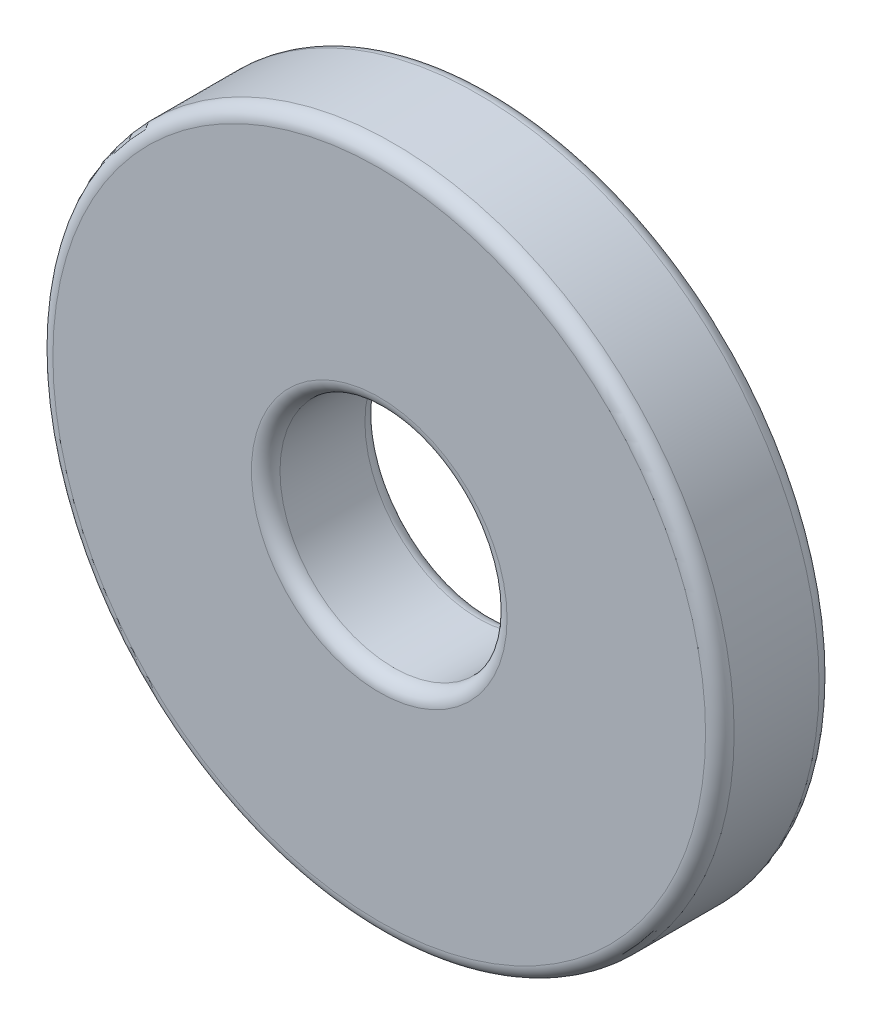
ISO-10303-21;
HEADER;
FILE_DESCRIPTION(('STEP AP214'),'2;1');
FILE_NAME('part.step','',(''),(''),'','','');
FILE_SCHEMA(('AUTOMOTIVE_DESIGN { 1 0 10303 214 1 1 1 1 }'));
ENDSEC;
DATA;
#1=APPLICATION_CONTEXT('core data for automotive mechanical design processes');
#2=APPLICATION_PROTOCOL_DEFINITION('international standard','automotive_design',2000,#1);
#3=PRODUCT_CONTEXT('',#1,'mechanical');
#4=PRODUCT('Part','Part','',(#3));
#5=PRODUCT_RELATED_PRODUCT_CATEGORY('part','',(#4));
#6=PRODUCT_DEFINITION_FORMATION('','',#4);
#7=PRODUCT_DEFINITION_CONTEXT('part definition',#1,'design');
#8=PRODUCT_DEFINITION('design','',#6,#7);
#9=PRODUCT_DEFINITION_SHAPE('','',#8);
#10=(LENGTH_UNIT() NAMED_UNIT(*) SI_UNIT(.MILLI.,.METRE.));
#11=(NAMED_UNIT(*) PLANE_ANGLE_UNIT() SI_UNIT($,.RADIAN.));
#12=(NAMED_UNIT(*) SI_UNIT($,.STERADIAN.) SOLID_ANGLE_UNIT());
#13=UNCERTAINTY_MEASURE_WITH_UNIT(LENGTH_MEASURE(1.E-05),#10,'distance_accuracy_value','');
#14=(GEOMETRIC_REPRESENTATION_CONTEXT(3) GLOBAL_UNCERTAINTY_ASSIGNED_CONTEXT((#13)) GLOBAL_UNIT_ASSIGNED_CONTEXT((#10,
#11,#12)) REPRESENTATION_CONTEXT('',''));
#15=CARTESIAN_POINT('',(0.,0.,0.));
#16=DIRECTION('',(0.,0.,1.));
#17=DIRECTION('',(1.,0.,0.));
#18=AXIS2_PLACEMENT_3D('',#15,#16,#17);
#19=CARTESIAN_POINT('',(68.3982464909084,3.21438697688714,1.5875));
#20=DIRECTION('',(0.,0.,-1.));
#21=DIRECTION('',(-1.,0.,0.));
#22=AXIS2_PLACEMENT_3D('',#19,#20,#21);
#23=CYLINDRICAL_SURFACE('',#22,4.7625);
#24=CARTESIAN_POINT('',(68.3982464909084,3.21438697688714,0.2));
#25=DIRECTION('',(0.,0.,1.));
#26=DIRECTION('',(1.,0.,0.));
#27=AXIS2_PLACEMENT_3D('',#24,#25,#26);
#28=CIRCLE('',#27,4.7625);
#29=CARTESIAN_POINT('',(73.1607464909084,3.21438697688714,0.2));
#30=VERTEX_POINT('',#29);
#31=EDGE_CURVE('E45',#30,#30,#28,.T.);
#32=ORIENTED_EDGE('',*,*,#31,.T.);
#33=EDGE_LOOP('',(#32));
#34=FACE_BOUND('',#33,.T.);
#35=CARTESIAN_POINT('',(68.3982464909084,3.21438697688714,1.3875));
#36=DIRECTION('',(0.,0.,1.));
#37=DIRECTION('',(1.,0.,0.));
#38=AXIS2_PLACEMENT_3D('',#35,#36,#37);
#39=CIRCLE('',#38,4.7625);
#40=CARTESIAN_POINT('',(73.1607464909084,3.21438697688714,1.3875));
#41=VERTEX_POINT('',#40);
#42=EDGE_CURVE('E50',#41,#41,#39,.F.);
#43=ORIENTED_EDGE('',*,*,#42,.T.);
#44=EDGE_LOOP('',(#43));
#45=FACE_BOUND('',#44,.T.);
#46=ADVANCED_FACE('F37',(#34,#45),#23,.T.);
#47=CARTESIAN_POINT('',(68.3982464909084,3.21438697688714,1.5875));
#48=DIRECTION('',(0.,0.,1.));
#49=DIRECTION('',(1.,0.,0.));
#50=AXIS2_PLACEMENT_3D('',#47,#48,#49);
#51=PLANE('',#50);
#52=CARTESIAN_POINT('',(68.3982464909084,3.21438697688714,1.5875));
#53=DIRECTION('',(0.,0.,1.));
#54=DIRECTION('',(1.,0.,0.));
#55=AXIS2_PLACEMENT_3D('',#52,#53,#54);
#56=CIRCLE('',#55,4.5625);
#57=CARTESIAN_POINT('',(72.9607464909084,3.21438697688714,1.5875));
#58=VERTEX_POINT('',#57);
#59=EDGE_CURVE('E55',#58,#58,#56,.T.);
#60=ORIENTED_EDGE('',*,*,#59,.T.);
#61=EDGE_LOOP('',(#60));
#62=FACE_BOUND('',#61,.T.);
#63=CARTESIAN_POINT('',(68.3982464909084,3.21438697688714,1.5875));
#64=DIRECTION('',(0.,0.,1.));
#65=DIRECTION('',(1.,0.,0.));
#66=AXIS2_PLACEMENT_3D('',#63,#64,#65);
#67=CIRCLE('',#66,1.7875);
#68=CARTESIAN_POINT('',(70.1857464909084,3.21438697688714,1.5875));
#69=VERTEX_POINT('',#68);
#70=EDGE_CURVE('E61',#69,#69,#67,.F.);
#71=ORIENTED_EDGE('',*,*,#70,.T.);
#72=EDGE_LOOP('',(#71));
#73=FACE_BOUND('',#72,.T.);
#74=ADVANCED_FACE('F86',(#62,#73),#51,.T.);
#75=CARTESIAN_POINT('',(68.3982464909084,3.21438697688714,0.));
#76=DIRECTION('',(0.,0.,1.));
#77=DIRECTION('',(1.,0.,0.));
#78=AXIS2_PLACEMENT_3D('',#75,#76,#77);
#79=PLANE('',#78);
#80=CARTESIAN_POINT('',(68.3982464909084,3.21438697688714,0.));
#81=DIRECTION('',(0.,0.,1.));
#82=DIRECTION('',(1.,0.,0.));
#83=AXIS2_PLACEMENT_3D('',#80,#81,#82);
#84=CIRCLE('',#83,4.5625);
#85=CARTESIAN_POINT('',(72.9607464909084,3.21438697688714,0.));
#86=VERTEX_POINT('',#85);
#87=EDGE_CURVE('E10',#86,#86,#84,.F.);
#88=ORIENTED_EDGE('',*,*,#87,.T.);
#89=EDGE_LOOP('',(#88));
#90=FACE_BOUND('',#89,.T.);
#91=CARTESIAN_POINT('',(68.3982464909084,3.21438697688714,0.));
#92=DIRECTION('',(0.,0.,1.));
#93=DIRECTION('',(1.,0.,0.));
#94=AXIS2_PLACEMENT_3D('',#91,#92,#93);
#95=CIRCLE('',#94,1.7875);
#96=CARTESIAN_POINT('',(70.1857464909084,3.21438697688714,0.));
#97=VERTEX_POINT('',#96);
#98=EDGE_CURVE('E65',#97,#97,#95,.T.);
#99=ORIENTED_EDGE('',*,*,#98,.T.);
#100=EDGE_LOOP('',(#99));
#101=FACE_BOUND('',#100,.T.);
#102=ADVANCED_FACE('F88',(#90,#101),#79,.F.);
#103=CARTESIAN_POINT('',(68.3982464909084,3.21438697688714,1.5875));
#104=DIRECTION('',(0.,0.,-1.));
#105=DIRECTION('',(-1.,0.,0.));
#106=AXIS2_PLACEMENT_3D('',#103,#104,#105);
#107=CYLINDRICAL_SURFACE('',#106,1.5875);
#108=CARTESIAN_POINT('',(68.3982464909084,3.21438697688714,0.2));
#109=DIRECTION('',(0.,0.,1.));
#110=DIRECTION('',(1.,0.,0.));
#111=AXIS2_PLACEMENT_3D('',#108,#109,#110);
#112=CIRCLE('',#111,1.5875);
#113=CARTESIAN_POINT('',(69.9857464909084,3.21438697688714,0.2));
#114=VERTEX_POINT('',#113);
#115=EDGE_CURVE('E69',#114,#114,#112,.F.);
#116=ORIENTED_EDGE('',*,*,#115,.T.);
#117=EDGE_LOOP('',(#116));
#118=FACE_BOUND('',#117,.T.);
#119=CARTESIAN_POINT('',(68.3982464909084,3.21438697688714,1.3875));
#120=DIRECTION('',(0.,0.,1.));
#121=DIRECTION('',(1.,0.,0.));
#122=AXIS2_PLACEMENT_3D('',#119,#120,#121);
#123=CIRCLE('',#122,1.5875);
#124=CARTESIAN_POINT('',(69.9857464909084,3.21438697688714,1.3875));
#125=VERTEX_POINT('',#124);
#126=EDGE_CURVE('E73',#125,#125,#123,.T.);
#127=ORIENTED_EDGE('',*,*,#126,.T.);
#128=EDGE_LOOP('',(#127));
#129=FACE_BOUND('',#128,.T.);
#130=ADVANCED_FACE('F78',(#118,#129),#107,.F.);
#131=CARTESIAN_POINT('',(68.3982464909084,3.21438697688714,0.2));
#132=DIRECTION('',(0.,0.,1.));
#133=DIRECTION('',(1.,0.,0.));
#134=AXIS2_PLACEMENT_3D('',#131,#132,#133);
#135=TOROIDAL_SURFACE('',#134,1.7875,0.2);
#136=ORIENTED_EDGE('',*,*,#98,.F.);
#137=EDGE_LOOP('',(#136));
#138=FACE_BOUND('',#137,.T.);
#139=ORIENTED_EDGE('',*,*,#115,.F.);
#140=EDGE_LOOP('',(#139));
#141=FACE_BOUND('',#140,.T.);
#142=ADVANCED_FACE('F99',(#138,#141),#135,.T.);
#143=CARTESIAN_POINT('',(68.3982464909084,3.21438697688714,1.3875));
#144=DIRECTION('',(0.,0.,1.));
#145=DIRECTION('',(1.,0.,0.));
#146=AXIS2_PLACEMENT_3D('',#143,#144,#145);
#147=TOROIDAL_SURFACE('',#146,4.5625,0.2);
#148=ORIENTED_EDGE('',*,*,#42,.F.);
#149=EDGE_LOOP('',(#148));
#150=FACE_BOUND('',#149,.T.);
#151=ORIENTED_EDGE('',*,*,#59,.F.);
#152=EDGE_LOOP('',(#151));
#153=FACE_BOUND('',#152,.T.);
#154=ADVANCED_FACE('F83',(#150,#153),#147,.T.);
#155=CARTESIAN_POINT('',(68.3982464909084,3.21438697688714,1.3875));
#156=DIRECTION('',(0.,0.,1.));
#157=DIRECTION('',(1.,0.,0.));
#158=AXIS2_PLACEMENT_3D('',#155,#156,#157);
#159=TOROIDAL_SURFACE('',#158,1.7875,0.2);
#160=ORIENTED_EDGE('',*,*,#126,.F.);
#161=EDGE_LOOP('',(#160));
#162=FACE_BOUND('',#161,.T.);
#163=ORIENTED_EDGE('',*,*,#70,.F.);
#164=EDGE_LOOP('',(#163));
#165=FACE_BOUND('',#164,.T.);
#166=ADVANCED_FACE('F80',(#162,#165),#159,.T.);
#167=CARTESIAN_POINT('',(68.3982464909084,3.21438697688714,0.2));
#168=DIRECTION('',(0.,0.,1.));
#169=DIRECTION('',(1.,0.,0.));
#170=AXIS2_PLACEMENT_3D('',#167,#168,#169);
#171=TOROIDAL_SURFACE('',#170,4.5625,0.2);
#172=ORIENTED_EDGE('',*,*,#87,.F.);
#173=EDGE_LOOP('',(#172));
#174=FACE_BOUND('',#173,.T.);
#175=ORIENTED_EDGE('',*,*,#31,.F.);
#176=EDGE_LOOP('',(#175));
#177=FACE_BOUND('',#176,.T.);
#178=ADVANCED_FACE('F39',(#174,#177),#171,.T.);
#179=CLOSED_SHELL('',(#46,#74,#102,#130,#142,#154,#166,#178));
#180=MANIFOLD_SOLID_BREP('B2',#179);
#181=ADVANCED_BREP_SHAPE_REPRESENTATION('',(#18,#180),#14);
#182=SHAPE_DEFINITION_REPRESENTATION(#9,#181);
ENDSEC;
END-ISO-10303-21;
